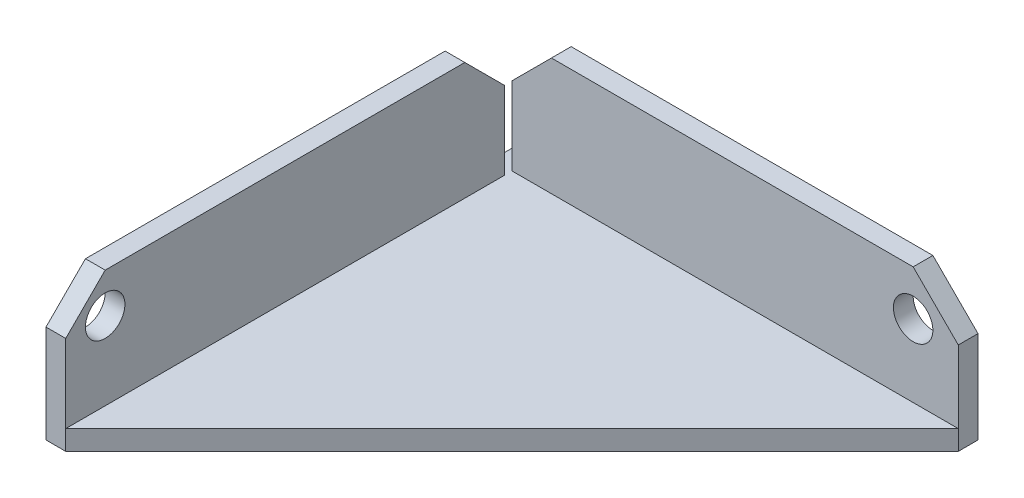
ISO-10303-21;
HEADER;
FILE_DESCRIPTION(('STEP AP214'),'2;1');
FILE_NAME('part.step','',(''),(''),'','','');
FILE_SCHEMA(('AUTOMOTIVE_DESIGN { 1 0 10303 214 1 1 1 1 }'));
ENDSEC;
DATA;
#1=APPLICATION_CONTEXT('core data for automotive mechanical design processes');
#2=APPLICATION_PROTOCOL_DEFINITION('international standard','automotive_design',2000,#1);
#3=PRODUCT_CONTEXT('',#1,'mechanical');
#4=PRODUCT('Part','Part','',(#3));
#5=PRODUCT_RELATED_PRODUCT_CATEGORY('part','',(#4));
#6=PRODUCT_DEFINITION_FORMATION('','',#4);
#7=PRODUCT_DEFINITION_CONTEXT('part definition',#1,'design');
#8=PRODUCT_DEFINITION('design','',#6,#7);
#9=PRODUCT_DEFINITION_SHAPE('','',#8);
#10=(LENGTH_UNIT() NAMED_UNIT(*) SI_UNIT(.MILLI.,.METRE.));
#11=(NAMED_UNIT(*) PLANE_ANGLE_UNIT() SI_UNIT($,.RADIAN.));
#12=(NAMED_UNIT(*) SI_UNIT($,.STERADIAN.) SOLID_ANGLE_UNIT());
#13=UNCERTAINTY_MEASURE_WITH_UNIT(LENGTH_MEASURE(1.E-05),#10,'distance_accuracy_value','');
#14=(GEOMETRIC_REPRESENTATION_CONTEXT(3) GLOBAL_UNCERTAINTY_ASSIGNED_CONTEXT((#13)) GLOBAL_UNIT_ASSIGNED_CONTEXT((#10,
#11,#12)) REPRESENTATION_CONTEXT('',''));
#15=CARTESIAN_POINT('',(0.,0.,0.));
#16=DIRECTION('',(0.,0.,1.));
#17=DIRECTION('',(1.,0.,0.));
#18=AXIS2_PLACEMENT_3D('',#15,#16,#17);
#19=CARTESIAN_POINT('',(0.,3.175,0.));
#20=DIRECTION('',(0.,-1.,0.));
#21=DIRECTION('',(0.,0.,-1.));
#22=AXIS2_PLACEMENT_3D('',#19,#20,#21);
#23=PLANE('',#22);
#24=DIRECTION('',(0.,0.,-1.));
#25=VECTOR('',#24,1.);
#26=CARTESIAN_POINT('',(-13.1703553166379,3.175,12.8976309576618));
#27=LINE('',#26,#25);
#28=CARTESIAN_POINT('',(-13.1703553166379,3.175,12.8976309576618));
#29=VERTEX_POINT('',#28);
#30=CARTESIAN_POINT('',(-13.1703553166379,3.175,-57.7013323544975));
#31=VERTEX_POINT('',#30);
#32=EDGE_CURVE('E258',#29,#31,#27,.T.);
#33=ORIENTED_EDGE('',*,*,#32,.F.);
#34=DIRECTION('',(-0.707106781186543,0.,0.707106781186552));
#35=VECTOR('',#34,1.);
#36=CARTESIAN_POINT('',(58.6716936519149,3.175,-58.9444180108919));
#37=LINE('',#36,#35);
#38=CARTESIAN_POINT('',(58.6716936519149,3.175,-58.9444180108919));
#39=VERTEX_POINT('',#38);
#40=EDGE_CURVE('E192',#39,#29,#37,.T.);
#41=ORIENTED_EDGE('',*,*,#40,.F.);
#42=DIRECTION('',(-1.,0.,0.));
#43=VECTOR('',#42,1.);
#44=CARTESIAN_POINT('',(0.,3.175,-58.9444180108919));
#45=LINE('',#44,#43);
#46=CARTESIAN_POINT('',(-13.1703553166379,3.175,-58.9444180108919));
#47=VERTEX_POINT('',#46);
#48=EDGE_CURVE('E171',#39,#47,#45,.T.);
#49=ORIENTED_EDGE('',*,*,#48,.T.);
#50=DIRECTION('',(0.,0.,-1.));
#51=VECTOR('',#50,1.);
#52=CARTESIAN_POINT('',(-13.170355316638,3.175,0.));
#53=LINE('',#52,#51);
#54=CARTESIAN_POINT('',(-13.1703553166379,3.175,-62.1194180108918));
#55=VERTEX_POINT('',#54);
#56=EDGE_CURVE('E167',#47,#55,#53,.T.);
#57=ORIENTED_EDGE('',*,*,#56,.T.);
#58=DIRECTION('',(1.,0.,0.));
#59=VECTOR('',#58,1.);
#60=CARTESIAN_POINT('',(-16.3453553166379,3.175,-62.1194180108918));
#61=LINE('',#60,#59);
#62=CARTESIAN_POINT('',(-16.3453553166379,3.175,-62.1194180108918));
#63=VERTEX_POINT('',#62);
#64=EDGE_CURVE('E188',#63,#55,#61,.T.);
#65=ORIENTED_EDGE('',*,*,#64,.F.);
#66=DIRECTION('',(0.,0.,-1.));
#67=VECTOR('',#66,1.);
#68=CARTESIAN_POINT('',(-16.3453553166379,3.175,12.8976309576618));
#69=LINE('',#68,#67);
#70=CARTESIAN_POINT('',(-16.3453553166379,3.175,-57.7013323544975));
#71=VERTEX_POINT('',#70);
#72=EDGE_CURVE('E185',#71,#63,#69,.T.);
#73=ORIENTED_EDGE('',*,*,#72,.F.);
#74=DIRECTION('',(-1.,0.,0.));
#75=VECTOR('',#74,1.);
#76=CARTESIAN_POINT('',(-13.1703553166379,3.175,-57.7013323544975));
#77=LINE('',#76,#75);
#78=EDGE_CURVE('E262',#31,#71,#77,.T.);
#79=ORIENTED_EDGE('',*,*,#78,.F.);
#80=EDGE_LOOP('',(#33,#41,#49,#57,#65,#73,#79));
#81=FACE_BOUND('',#80,.T.);
#82=ADVANCED_FACE('F39',(#81),#23,.F.);
#83=CARTESIAN_POINT('',(-13.1703553166379,3.175,12.8976309576618));
#84=DIRECTION('',(0.,0.,1.));
#85=DIRECTION('',(1.,0.,0.));
#86=AXIS2_PLACEMENT_3D('',#83,#84,#85);
#87=PLANE('',#86);
#88=DIRECTION('',(-1.,0.,0.));
#89=VECTOR('',#88,1.);
#90=CARTESIAN_POINT('',(2.57764468336207,15.748,12.8976309576618));
#91=LINE('',#90,#89);
#92=CARTESIAN_POINT('',(-13.1703553166379,15.748,12.8976309576618));
#93=VERTEX_POINT('',#92);
#94=CARTESIAN_POINT('',(-16.3453553166379,15.748,12.8976309576618));
#95=VERTEX_POINT('',#94);
#96=EDGE_CURVE('E299',#93,#95,#91,.T.);
#97=ORIENTED_EDGE('',*,*,#96,.T.);
#98=DIRECTION('',(0.,-1.,0.));
#99=VECTOR('',#98,1.);
#100=CARTESIAN_POINT('',(-16.3453553166379,3.175,12.8976309576618));
#101=LINE('',#100,#99);
#102=CARTESIAN_POINT('',(-16.3453553166379,0.,12.8976309576618));
#103=VERTEX_POINT('',#102);
#104=EDGE_CURVE('E196',#95,#103,#101,.T.);
#105=ORIENTED_EDGE('',*,*,#104,.T.);
#106=DIRECTION('',(-1.,0.,0.));
#107=VECTOR('',#106,1.);
#108=CARTESIAN_POINT('',(-13.1703553166379,0.,12.8976309576618));
#109=LINE('',#108,#107);
#110=CARTESIAN_POINT('',(-13.1703553166379,0.,12.8976309576618));
#111=VERTEX_POINT('',#110);
#112=EDGE_CURVE('E184',#111,#103,#109,.T.);
#113=ORIENTED_EDGE('',*,*,#112,.F.);
#114=DIRECTION('',(0.,-1.,0.));
#115=VECTOR('',#114,1.);
#116=CARTESIAN_POINT('',(-13.1703553166379,3.175,12.8976309576618));
#117=LINE('',#116,#115);
#118=EDGE_CURVE('E215',#29,#111,#117,.T.);
#119=ORIENTED_EDGE('',*,*,#118,.F.);
#120=DIRECTION('',(0.,-1.,0.));
#121=VECTOR('',#120,1.);
#122=CARTESIAN_POINT('',(-13.1703553166379,22.098,12.8976309576618));
#123=LINE('',#122,#121);
#124=EDGE_CURVE('E175',#93,#29,#123,.T.);
#125=ORIENTED_EDGE('',*,*,#124,.F.);
#126=EDGE_LOOP('',(#97,#105,#113,#119,#125));
#127=FACE_BOUND('',#126,.T.);
#128=ADVANCED_FACE('F41',(#127),#87,.T.);
#129=CARTESIAN_POINT('',(58.6716936519149,3.175,-58.9444180108919));
#130=DIRECTION('',(0.707106781186552,0.,0.707106781186543));
#131=DIRECTION('',(0.707106781186543,0.,-0.707106781186552));
#132=AXIS2_PLACEMENT_3D('',#129,#130,#131);
#133=PLANE('',#132);
#134=DIRECTION('',(-0.707106781186543,0.,0.707106781186552));
#135=VECTOR('',#134,1.);
#136=CARTESIAN_POINT('',(58.6716936519149,0.,-58.9444180108919));
#137=LINE('',#136,#135);
#138=CARTESIAN_POINT('',(58.6716936519149,0.,-58.9444180108919));
#139=VERTEX_POINT('',#138);
#140=EDGE_CURVE('E189',#139,#111,#137,.T.);
#141=ORIENTED_EDGE('',*,*,#140,.F.);
#142=DIRECTION('',(0.,-1.,0.));
#143=VECTOR('',#142,1.);
#144=CARTESIAN_POINT('',(58.6716936519149,3.175,-58.9444180108919));
#145=LINE('',#144,#143);
#146=EDGE_CURVE('E219',#39,#139,#145,.T.);
#147=ORIENTED_EDGE('',*,*,#146,.F.);
#148=ORIENTED_EDGE('',*,*,#40,.T.);
#149=ORIENTED_EDGE('',*,*,#118,.T.);
#150=EDGE_LOOP('',(#141,#147,#148,#149));
#151=FACE_BOUND('',#150,.T.);
#152=ADVANCED_FACE('F331',(#151),#133,.T.);
#153=CARTESIAN_POINT('',(58.6716936519149,3.175,-62.1194180108918));
#154=DIRECTION('',(1.,0.,0.));
#155=DIRECTION('',(0.,0.,-1.));
#156=AXIS2_PLACEMENT_3D('',#153,#154,#155);
#157=PLANE('',#156);
#158=DIRECTION('',(0.,0.,-1.));
#159=VECTOR('',#158,1.);
#160=CARTESIAN_POINT('',(58.6716936519149,14.8349351273937,-43.1964180108918));
#161=LINE('',#160,#159);
#162=CARTESIAN_POINT('',(58.6716936519149,14.8349351273937,-58.9444180108919));
#163=VERTEX_POINT('',#162);
#164=CARTESIAN_POINT('',(58.6716936519149,14.8349351273937,-62.1194180108918));
#165=VERTEX_POINT('',#164);
#166=EDGE_CURVE('E157',#163,#165,#161,.T.);
#167=ORIENTED_EDGE('',*,*,#166,.F.);
#168=DIRECTION('',(0.,-1.,0.));
#169=VECTOR('',#168,1.);
#170=CARTESIAN_POINT('',(58.6716936519149,22.098,-58.9444180108919));
#171=LINE('',#170,#169);
#172=EDGE_CURVE('E181',#163,#39,#171,.T.);
#173=ORIENTED_EDGE('',*,*,#172,.T.);
#174=ORIENTED_EDGE('',*,*,#146,.T.);
#175=DIRECTION('',(0.,0.,1.));
#176=VECTOR('',#175,1.);
#177=CARTESIAN_POINT('',(58.6716936519149,0.,-62.1194180108918));
#178=LINE('',#177,#176);
#179=CARTESIAN_POINT('',(58.6716936519149,0.,-62.1194180108918));
#180=VERTEX_POINT('',#179);
#181=EDGE_CURVE('E208',#180,#139,#178,.T.);
#182=ORIENTED_EDGE('',*,*,#181,.F.);
#183=DIRECTION('',(0.,-1.,0.));
#184=VECTOR('',#183,1.);
#185=CARTESIAN_POINT('',(58.6716936519149,3.175,-62.1194180108918));
#186=LINE('',#185,#184);
#187=EDGE_CURVE('E222',#165,#180,#186,.T.);
#188=ORIENTED_EDGE('',*,*,#187,.F.);
#189=EDGE_LOOP('',(#167,#173,#174,#182,#188));
#190=FACE_BOUND('',#189,.T.);
#191=ADVANCED_FACE('F340',(#190),#157,.T.);
#192=CARTESIAN_POINT('',(-16.3453553166379,3.175,-62.1194180108918));
#193=DIRECTION('',(0.,0.,-1.));
#194=DIRECTION('',(-1.,0.,0.));
#195=AXIS2_PLACEMENT_3D('',#192,#193,#194);
#196=PLANE('',#195);
#197=CARTESIAN_POINT('',(51.4086287793085,14.8349351273937,-62.1194180108918));
#198=DIRECTION('',(0.,0.,-1.));
#199=DIRECTION('',(-1.,0.,0.));
#200=AXIS2_PLACEMENT_3D('',#197,#198,#199);
#201=CIRCLE('',#200,3.175);
#202=CARTESIAN_POINT('',(48.2336287793085,14.8349351273937,-62.1194180108918));
#203=VERTEX_POINT('',#202);
#204=EDGE_CURVE('E362',#203,#203,#201,.T.);
#205=ORIENTED_EDGE('',*,*,#204,.F.);
#206=EDGE_LOOP('',(#205));
#207=FACE_BOUND('',#206,.T.);
#208=DIRECTION('',(-0.707106781186551,-0.707106781186544,0.));
#209=VECTOR('',#208,1.);
#210=CARTESIAN_POINT('',(-13.1703553166379,15.748,-62.1194180108918));
#211=LINE('',#210,#209);
#212=CARTESIAN_POINT('',(-6.82035531663787,22.098,-62.1194180108918));
#213=VERTEX_POINT('',#212);
#214=CARTESIAN_POINT('',(-13.1703553166379,15.748,-62.1194180108918));
#215=VERTEX_POINT('',#214);
#216=EDGE_CURVE('E140',#213,#215,#211,.T.);
#217=ORIENTED_EDGE('',*,*,#216,.F.);
#218=DIRECTION('',(-1.,0.,0.));
#219=VECTOR('',#218,1.);
#220=CARTESIAN_POINT('',(0.,22.098,-62.1194180108918));
#221=LINE('',#220,#219);
#222=CARTESIAN_POINT('',(51.4086287793085,22.098,-62.1194180108918));
#223=VERTEX_POINT('',#222);
#224=EDGE_CURVE('E153',#223,#213,#221,.T.);
#225=ORIENTED_EDGE('',*,*,#224,.F.);
#226=DIRECTION('',(-0.707106781186551,0.707106781186544,0.));
#227=VECTOR('',#226,1.);
#228=CARTESIAN_POINT('',(58.6716936519149,14.8349351273937,-62.1194180108918));
#229=LINE('',#228,#227);
#230=EDGE_CURVE('E54',#165,#223,#229,.T.);
#231=ORIENTED_EDGE('',*,*,#230,.F.);
#232=ORIENTED_EDGE('',*,*,#187,.T.);
#233=DIRECTION('',(1.,0.,0.));
#234=VECTOR('',#233,1.);
#235=CARTESIAN_POINT('',(-16.3453553166379,0.,-62.1194180108918));
#236=LINE('',#235,#234);
#237=CARTESIAN_POINT('',(-16.3453553166379,0.,-62.1194180108918));
#238=VERTEX_POINT('',#237);
#239=EDGE_CURVE('E204',#238,#180,#236,.T.);
#240=ORIENTED_EDGE('',*,*,#239,.F.);
#241=DIRECTION('',(0.,-1.,0.));
#242=VECTOR('',#241,1.);
#243=CARTESIAN_POINT('',(-16.3453553166379,3.175,-62.1194180108918));
#244=LINE('',#243,#242);
#245=EDGE_CURVE('E225',#63,#238,#244,.T.);
#246=ORIENTED_EDGE('',*,*,#245,.F.);
#247=ORIENTED_EDGE('',*,*,#64,.T.);
#248=DIRECTION('',(0.,-1.,0.));
#249=VECTOR('',#248,1.);
#250=CARTESIAN_POINT('',(-13.1703553166379,22.098,-62.1194180108918));
#251=LINE('',#250,#249);
#252=EDGE_CURVE('E155',#215,#55,#251,.T.);
#253=ORIENTED_EDGE('',*,*,#252,.F.);
#254=EDGE_LOOP('',(#217,#225,#231,#232,#240,#246,#247,#253));
#255=FACE_BOUND('',#254,.T.);
#256=ADVANCED_FACE('F152',(#207,#255),#196,.T.);
#257=CARTESIAN_POINT('',(-16.3453553166379,3.175,12.8976309576618));
#258=DIRECTION('',(-1.,0.,0.));
#259=DIRECTION('',(0.,0.,1.));
#260=AXIS2_PLACEMENT_3D('',#257,#258,#259);
#261=PLANE('',#260);
#262=CARTESIAN_POINT('',(-16.3453553166379,15.748,6.54763095766174));
#263=DIRECTION('',(-1.,0.,0.));
#264=DIRECTION('',(0.,0.,1.));
#265=AXIS2_PLACEMENT_3D('',#262,#263,#264);
#266=CIRCLE('',#265,3.175);
#267=CARTESIAN_POINT('',(-16.3453553166379,15.748,9.72263095766174));
#268=VERTEX_POINT('',#267);
#269=EDGE_CURVE('E353',#268,#268,#266,.T.);
#270=ORIENTED_EDGE('',*,*,#269,.F.);
#271=EDGE_LOOP('',(#270));
#272=FACE_BOUND('',#271,.T.);
#273=DIRECTION('',(0.,-0.707106781186544,0.707106781186551));
#274=VECTOR('',#273,1.);
#275=CARTESIAN_POINT('',(-16.3453553166379,22.098,6.54763095766174));
#276=LINE('',#275,#274);
#277=CARTESIAN_POINT('',(-16.3453553166379,22.098,6.54763095766174));
#278=VERTEX_POINT('',#277);
#279=EDGE_CURVE('E296',#278,#95,#276,.T.);
#280=ORIENTED_EDGE('',*,*,#279,.F.);
#281=DIRECTION('',(0.,0.,-1.));
#282=VECTOR('',#281,1.);
#283=CARTESIAN_POINT('',(-16.3453553166379,22.098,12.8976309576618));
#284=LINE('',#283,#282);
#285=CARTESIAN_POINT('',(-16.3453553166379,22.098,-51.3513323544976));
#286=VERTEX_POINT('',#285);
#287=EDGE_CURVE('E241',#278,#286,#284,.T.);
#288=ORIENTED_EDGE('',*,*,#287,.T.);
#289=DIRECTION('',(0.,0.707106781186552,0.707106781186543));
#290=VECTOR('',#289,1.);
#291=CARTESIAN_POINT('',(-16.3453553166379,15.748,-57.7013323544975));
#292=LINE('',#291,#290);
#293=CARTESIAN_POINT('',(-16.3453553166379,15.748,-57.7013323544975));
#294=VERTEX_POINT('',#293);
#295=EDGE_CURVE('E308',#294,#286,#292,.T.);
#296=ORIENTED_EDGE('',*,*,#295,.F.);
#297=DIRECTION('',(0.,-1.,0.));
#298=VECTOR('',#297,1.);
#299=CARTESIAN_POINT('',(-16.3453553166379,22.098,-57.7013323544975));
#300=LINE('',#299,#298);
#301=EDGE_CURVE('E253',#294,#71,#300,.T.);
#302=ORIENTED_EDGE('',*,*,#301,.T.);
#303=ORIENTED_EDGE('',*,*,#72,.T.);
#304=ORIENTED_EDGE('',*,*,#245,.T.);
#305=DIRECTION('',(0.,0.,-1.));
#306=VECTOR('',#305,1.);
#307=CARTESIAN_POINT('',(-16.3453553166379,0.,12.8976309576618));
#308=LINE('',#307,#306);
#309=EDGE_CURVE('E200',#103,#238,#308,.T.);
#310=ORIENTED_EDGE('',*,*,#309,.F.);
#311=ORIENTED_EDGE('',*,*,#104,.F.);
#312=EDGE_LOOP('',(#280,#288,#296,#302,#303,#304,#310,#311));
#313=FACE_BOUND('',#312,.T.);
#314=ADVANCED_FACE('F286',(#272,#313),#261,.T.);
#315=CARTESIAN_POINT('',(0.,0.,0.));
#316=DIRECTION('',(0.,-1.,0.));
#317=DIRECTION('',(0.,0.,-1.));
#318=AXIS2_PLACEMENT_3D('',#315,#316,#317);
#319=PLANE('',#318);
#320=ORIENTED_EDGE('',*,*,#112,.T.);
#321=ORIENTED_EDGE('',*,*,#309,.T.);
#322=ORIENTED_EDGE('',*,*,#239,.T.);
#323=ORIENTED_EDGE('',*,*,#181,.T.);
#324=ORIENTED_EDGE('',*,*,#140,.T.);
#325=EDGE_LOOP('',(#320,#321,#322,#323,#324));
#326=FACE_BOUND('',#325,.T.);
#327=ADVANCED_FACE('F293',(#326),#319,.T.);
#328=CARTESIAN_POINT('',(0.,22.098,-58.9444180108919));
#329=DIRECTION('',(0.,0.,1.));
#330=DIRECTION('',(1.,0.,0.));
#331=AXIS2_PLACEMENT_3D('',#328,#329,#330);
#332=PLANE('',#331);
#333=CARTESIAN_POINT('',(51.4086287793085,14.8349351273937,-58.9444180108919));
#334=DIRECTION('',(0.,0.,1.));
#335=DIRECTION('',(1.,0.,0.));
#336=AXIS2_PLACEMENT_3D('',#333,#334,#335);
#337=CIRCLE('',#336,3.175);
#338=CARTESIAN_POINT('',(54.5836287793085,14.8349351273937,-58.9444180108919));
#339=VERTEX_POINT('',#338);
#340=EDGE_CURVE('E537',#339,#339,#337,.T.);
#341=ORIENTED_EDGE('',*,*,#340,.F.);
#342=EDGE_LOOP('',(#341));
#343=FACE_BOUND('',#342,.T.);
#344=DIRECTION('',(0.707106781186551,0.707106781186544,0.));
#345=VECTOR('',#344,1.);
#346=CARTESIAN_POINT('',(-3.4101776583189,25.5081776583189,-58.9444180108919));
#347=LINE('',#346,#345);
#348=CARTESIAN_POINT('',(-13.1703553166379,15.748,-58.9444180108919));
#349=VERTEX_POINT('',#348);
#350=CARTESIAN_POINT('',(-6.82035531663787,22.098,-58.9444180108919));
#351=VERTEX_POINT('',#350);
#352=EDGE_CURVE('E62',#349,#351,#347,.T.);
#353=ORIENTED_EDGE('',*,*,#352,.F.);
#354=DIRECTION('',(0.,-1.,0.));
#355=VECTOR('',#354,1.);
#356=CARTESIAN_POINT('',(-13.1703553166379,22.098,-58.9444180108919));
#357=LINE('',#356,#355);
#358=EDGE_CURVE('E161',#349,#47,#357,.T.);
#359=ORIENTED_EDGE('',*,*,#358,.T.);
#360=ORIENTED_EDGE('',*,*,#48,.F.);
#361=ORIENTED_EDGE('',*,*,#172,.F.);
#362=DIRECTION('',(0.707106781186551,-0.707106781186544,0.));
#363=VECTOR('',#362,1.);
#364=CARTESIAN_POINT('',(25.704314389654,47.8023143896543,-58.9444180108919));
#365=LINE('',#364,#363);
#366=CARTESIAN_POINT('',(51.4086287793085,22.098,-58.9444180108919));
#367=VERTEX_POINT('',#366);
#368=EDGE_CURVE('E311',#367,#163,#365,.T.);
#369=ORIENTED_EDGE('',*,*,#368,.F.);
#370=DIRECTION('',(-1.,0.,0.));
#371=VECTOR('',#370,1.);
#372=CARTESIAN_POINT('',(0.,22.098,-58.9444180108919));
#373=LINE('',#372,#371);
#374=EDGE_CURVE('E162',#367,#351,#373,.T.);
#375=ORIENTED_EDGE('',*,*,#374,.T.);
#376=EDGE_LOOP('',(#353,#359,#360,#361,#369,#375));
#377=FACE_BOUND('',#376,.T.);
#378=ADVANCED_FACE('F334',(#343,#377),#332,.T.);
#379=CARTESIAN_POINT('',(-13.170355316638,22.098,0.));
#380=DIRECTION('',(-1.,0.,0.));
#381=DIRECTION('',(0.,0.,1.));
#382=AXIS2_PLACEMENT_3D('',#379,#380,#381);
#383=PLANE('',#382);
#384=DIRECTION('',(0.,0.,-1.));
#385=VECTOR('',#384,1.);
#386=CARTESIAN_POINT('',(-13.1703553166379,15.748,-43.1964180108918));
#387=LINE('',#386,#385);
#388=EDGE_CURVE('E147',#349,#215,#387,.T.);
#389=ORIENTED_EDGE('',*,*,#388,.T.);
#390=ORIENTED_EDGE('',*,*,#252,.T.);
#391=ORIENTED_EDGE('',*,*,#56,.F.);
#392=ORIENTED_EDGE('',*,*,#358,.F.);
#393=EDGE_LOOP('',(#389,#390,#391,#392));
#394=FACE_BOUND('',#393,.T.);
#395=ADVANCED_FACE('F382',(#394),#383,.T.);
#396=CARTESIAN_POINT('',(0.,22.098,0.));
#397=DIRECTION('',(0.,1.,0.));
#398=DIRECTION('',(0.,0.,1.));
#399=AXIS2_PLACEMENT_3D('',#396,#397,#398);
#400=PLANE('',#399);
#401=DIRECTION('',(0.,0.,-1.));
#402=VECTOR('',#401,1.);
#403=CARTESIAN_POINT('',(-6.82035531663787,22.098,-43.1964180108918));
#404=LINE('',#403,#402);
#405=EDGE_CURVE('E137',#351,#213,#404,.T.);
#406=ORIENTED_EDGE('',*,*,#405,.F.);
#407=ORIENTED_EDGE('',*,*,#374,.F.);
#408=DIRECTION('',(0.,0.,1.));
#409=VECTOR('',#408,1.);
#410=CARTESIAN_POINT('',(51.4086287793085,22.098,0.));
#411=LINE('',#410,#409);
#412=EDGE_CURVE('E11',#223,#367,#411,.T.);
#413=ORIENTED_EDGE('',*,*,#412,.F.);
#414=ORIENTED_EDGE('',*,*,#224,.T.);
#415=EDGE_LOOP('',(#406,#407,#413,#414));
#416=FACE_BOUND('',#415,.T.);
#417=ADVANCED_FACE('F159',(#416),#400,.T.);
#418=CARTESIAN_POINT('',(-13.1703553166379,22.098,12.8976309576618));
#419=DIRECTION('',(-1.,0.,0.));
#420=DIRECTION('',(0.,0.,1.));
#421=AXIS2_PLACEMENT_3D('',#418,#419,#420);
#422=PLANE('',#421);
#423=CARTESIAN_POINT('',(-13.1703553166379,15.748,6.54763095766174));
#424=DIRECTION('',(1.,0.,0.));
#425=DIRECTION('',(0.,0.,-1.));
#426=AXIS2_PLACEMENT_3D('',#423,#424,#425);
#427=CIRCLE('',#426,3.175);
#428=CARTESIAN_POINT('',(-13.1703553166379,15.748,3.37263095766174));
#429=VERTEX_POINT('',#428);
#430=EDGE_CURVE('E356',#429,#429,#427,.T.);
#431=ORIENTED_EDGE('',*,*,#430,.F.);
#432=EDGE_LOOP('',(#431));
#433=FACE_BOUND('',#432,.T.);
#434=DIRECTION('',(0.,-1.,0.));
#435=VECTOR('',#434,1.);
#436=CARTESIAN_POINT('',(-13.1703553166379,22.098,-57.7013323544975));
#437=LINE('',#436,#435);
#438=CARTESIAN_POINT('',(-13.1703553166379,15.748,-57.7013323544975));
#439=VERTEX_POINT('',#438);
#440=EDGE_CURVE('E257',#439,#31,#437,.T.);
#441=ORIENTED_EDGE('',*,*,#440,.F.);
#442=DIRECTION('',(0.,0.707106781186552,0.707106781186543));
#443=VECTOR('',#442,1.);
#444=CARTESIAN_POINT('',(-13.1703553166379,54.2224816560797,-19.2268506984183));
#445=LINE('',#444,#443);
#446=CARTESIAN_POINT('',(-13.1703553166379,22.098,-51.3513323544976));
#447=VERTEX_POINT('',#446);
#448=EDGE_CURVE('E251',#439,#447,#445,.T.);
#449=ORIENTED_EDGE('',*,*,#448,.T.);
#450=DIRECTION('',(0.,0.,-1.));
#451=VECTOR('',#450,1.);
#452=CARTESIAN_POINT('',(-13.1703553166379,22.098,12.8976309576618));
#453=LINE('',#452,#451);
#454=CARTESIAN_POINT('',(-13.1703553166379,22.098,6.54763095766174));
#455=VERTEX_POINT('',#454);
#456=EDGE_CURVE('E238',#455,#447,#453,.T.);
#457=ORIENTED_EDGE('',*,*,#456,.F.);
#458=DIRECTION('',(0.,-0.707106781186544,0.707106781186551));
#459=VECTOR('',#458,1.);
#460=CARTESIAN_POINT('',(-13.1703553166379,18.923,9.72263095766181));
#461=LINE('',#460,#459);
#462=EDGE_CURVE('E249',#455,#93,#461,.T.);
#463=ORIENTED_EDGE('',*,*,#462,.T.);
#464=ORIENTED_EDGE('',*,*,#124,.T.);
#465=ORIENTED_EDGE('',*,*,#32,.T.);
#466=EDGE_LOOP('',(#441,#449,#457,#463,#464,#465));
#467=FACE_BOUND('',#466,.T.);
#468=ADVANCED_FACE('F248',(#433,#467),#422,.F.);
#469=CARTESIAN_POINT('',(-13.1703553166379,22.098,-57.7013323544975));
#470=DIRECTION('',(0.,0.,1.));
#471=DIRECTION('',(1.,0.,0.));
#472=AXIS2_PLACEMENT_3D('',#469,#470,#471);
#473=PLANE('',#472);
#474=ORIENTED_EDGE('',*,*,#301,.F.);
#475=DIRECTION('',(-1.,0.,0.));
#476=VECTOR('',#475,1.);
#477=CARTESIAN_POINT('',(2.57764468336207,15.748,-57.7013323544975));
#478=LINE('',#477,#476);
#479=EDGE_CURVE('E278',#439,#294,#478,.T.);
#480=ORIENTED_EDGE('',*,*,#479,.F.);
#481=ORIENTED_EDGE('',*,*,#440,.T.);
#482=ORIENTED_EDGE('',*,*,#78,.T.);
#483=EDGE_LOOP('',(#474,#480,#481,#482));
#484=FACE_BOUND('',#483,.T.);
#485=ADVANCED_FACE('F275',(#484),#473,.F.);
#486=CARTESIAN_POINT('',(0.,22.098,0.));
#487=DIRECTION('',(0.,-1.,0.));
#488=DIRECTION('',(0.,0.,-1.));
#489=AXIS2_PLACEMENT_3D('',#486,#487,#488);
#490=PLANE('',#489);
#491=ORIENTED_EDGE('',*,*,#287,.F.);
#492=DIRECTION('',(1.,0.,0.));
#493=VECTOR('',#492,1.);
#494=CARTESIAN_POINT('',(0.,22.098,6.54763095766174));
#495=LINE('',#494,#493);
#496=EDGE_CURVE('E48',#278,#455,#495,.T.);
#497=ORIENTED_EDGE('',*,*,#496,.T.);
#498=ORIENTED_EDGE('',*,*,#456,.T.);
#499=DIRECTION('',(-1.,0.,0.));
#500=VECTOR('',#499,1.);
#501=CARTESIAN_POINT('',(0.,22.098,-51.3513323544976));
#502=LINE('',#501,#500);
#503=EDGE_CURVE('E218',#447,#286,#502,.T.);
#504=ORIENTED_EDGE('',*,*,#503,.T.);
#505=EDGE_LOOP('',(#491,#497,#498,#504));
#506=FACE_BOUND('',#505,.T.);
#507=ADVANCED_FACE('F237',(#506),#490,.F.);
#508=CARTESIAN_POINT('',(2.57764468336207,15.748,-57.7013323544975));
#509=DIRECTION('',(0.,-0.707106781186543,0.707106781186552));
#510=DIRECTION('',(0.,-0.707106781186552,-0.707106781186543));
#511=AXIS2_PLACEMENT_3D('',#508,#509,#510);
#512=PLANE('',#511);
#513=ORIENTED_EDGE('',*,*,#479,.T.);
#514=ORIENTED_EDGE('',*,*,#295,.T.);
#515=ORIENTED_EDGE('',*,*,#503,.F.);
#516=ORIENTED_EDGE('',*,*,#448,.F.);
#517=EDGE_LOOP('',(#513,#514,#515,#516));
#518=FACE_BOUND('',#517,.T.);
#519=ADVANCED_FACE('F315',(#518),#512,.F.);
#520=CARTESIAN_POINT('',(2.57764468336207,22.098,6.54763095766174));
#521=DIRECTION('',(0.,-0.707106781186551,-0.707106781186544));
#522=DIRECTION('',(0.,0.707106781186544,-0.707106781186551));
#523=AXIS2_PLACEMENT_3D('',#520,#521,#522);
#524=PLANE('',#523);
#525=ORIENTED_EDGE('',*,*,#496,.F.);
#526=ORIENTED_EDGE('',*,*,#279,.T.);
#527=ORIENTED_EDGE('',*,*,#96,.F.);
#528=ORIENTED_EDGE('',*,*,#462,.F.);
#529=EDGE_LOOP('',(#525,#526,#527,#528));
#530=FACE_BOUND('',#529,.T.);
#531=ADVANCED_FACE('F317',(#530),#524,.F.);
#532=CARTESIAN_POINT('',(58.6716936519149,14.8349351273937,-43.1964180108918));
#533=DIRECTION('',(-0.707106781186544,-0.707106781186551,0.));
#534=DIRECTION('',(0.707106781186551,-0.707106781186544,0.));
#535=AXIS2_PLACEMENT_3D('',#532,#533,#534);
#536=PLANE('',#535);
#537=ORIENTED_EDGE('',*,*,#368,.T.);
#538=ORIENTED_EDGE('',*,*,#166,.T.);
#539=ORIENTED_EDGE('',*,*,#230,.T.);
#540=ORIENTED_EDGE('',*,*,#412,.T.);
#541=EDGE_LOOP('',(#537,#538,#539,#540));
#542=FACE_BOUND('',#541,.T.);
#543=ADVANCED_FACE('F323',(#542),#536,.F.);
#544=CARTESIAN_POINT('',(-13.1703553166379,15.748,-43.1964180108918));
#545=DIRECTION('',(0.707106781186544,-0.707106781186551,0.));
#546=DIRECTION('',(0.707106781186551,0.707106781186544,0.));
#547=AXIS2_PLACEMENT_3D('',#544,#545,#546);
#548=PLANE('',#547);
#549=ORIENTED_EDGE('',*,*,#352,.T.);
#550=ORIENTED_EDGE('',*,*,#405,.T.);
#551=ORIENTED_EDGE('',*,*,#216,.T.);
#552=ORIENTED_EDGE('',*,*,#388,.F.);
#553=EDGE_LOOP('',(#549,#550,#551,#552));
#554=FACE_BOUND('',#553,.T.);
#555=ADVANCED_FACE('F139',(#554),#548,.F.);
#556=CARTESIAN_POINT('',(-32.0933553166379,15.748,6.54763095766174));
#557=DIRECTION('',(1.,0.,0.));
#558=DIRECTION('',(0.,0.,-1.));
#559=AXIS2_PLACEMENT_3D('',#556,#557,#558);
#560=CYLINDRICAL_SURFACE('',#559,3.175);
#561=ORIENTED_EDGE('',*,*,#269,.T.);
#562=EDGE_LOOP('',(#561));
#563=FACE_BOUND('',#562,.T.);
#564=ORIENTED_EDGE('',*,*,#430,.T.);
#565=EDGE_LOOP('',(#564));
#566=FACE_BOUND('',#565,.T.);
#567=ADVANCED_FACE('F399',(#563,#566),#560,.F.);
#568=CARTESIAN_POINT('',(51.4086287793085,14.8349351273937,-77.8674180108919));
#569=DIRECTION('',(0.,0.,1.));
#570=DIRECTION('',(1.,0.,0.));
#571=AXIS2_PLACEMENT_3D('',#568,#569,#570);
#572=CYLINDRICAL_SURFACE('',#571,3.175);
#573=ORIENTED_EDGE('',*,*,#204,.T.);
#574=EDGE_LOOP('',(#573));
#575=FACE_BOUND('',#574,.T.);
#576=ORIENTED_EDGE('',*,*,#340,.T.);
#577=EDGE_LOOP('',(#576));
#578=FACE_BOUND('',#577,.T.);
#579=ADVANCED_FACE('F401',(#575,#578),#572,.F.);
#580=CLOSED_SHELL('',(#82,#128,#152,#191,#256,#314,#327,#378,#395,#417,#468,#485,#507,#519,#531,
#543,#555,#567,#579));
#581=MANIFOLD_SOLID_BREP('B2',#580);
#582=ADVANCED_BREP_SHAPE_REPRESENTATION('',(#18,#581),#14);
#583=SHAPE_DEFINITION_REPRESENTATION(#9,#582);
ENDSEC;
END-ISO-10303-21;
